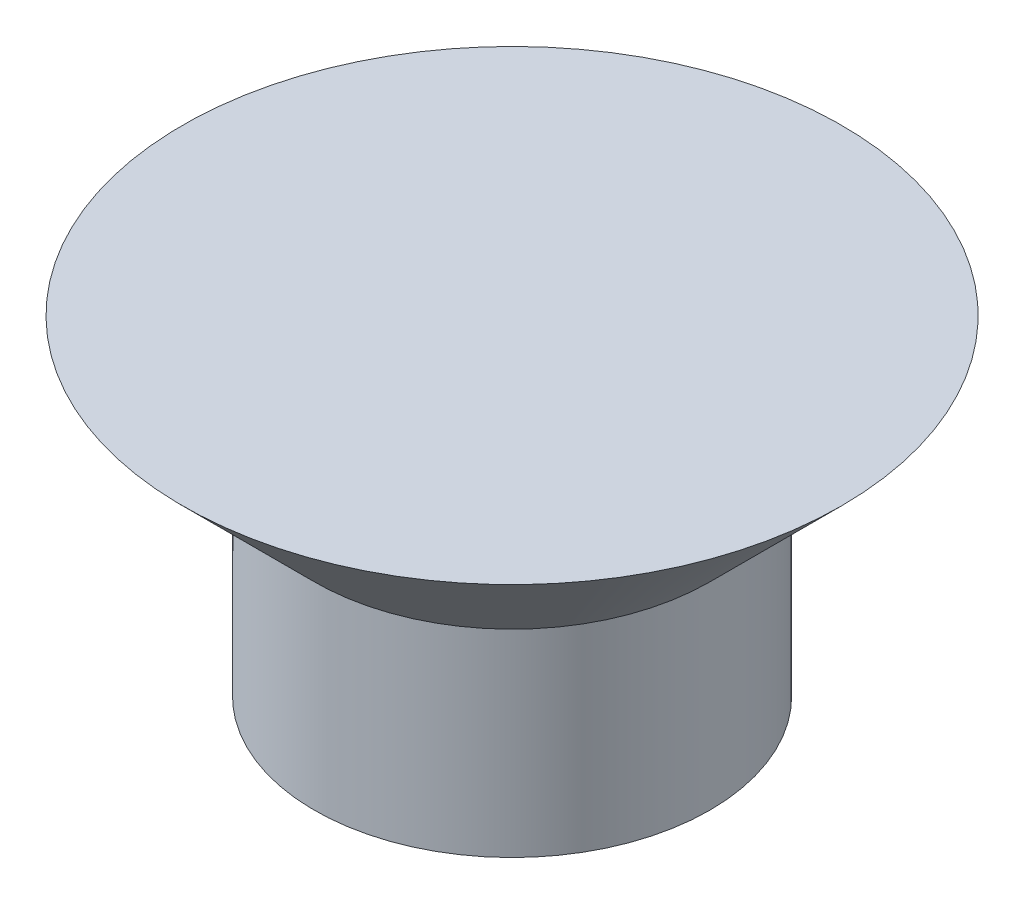
ISO-10303-21;
HEADER;
FILE_DESCRIPTION(('STEP AP214'),'2;1');
FILE_NAME('part.step','',(''),(''),'','','');
FILE_SCHEMA(('AUTOMOTIVE_DESIGN { 1 0 10303 214 1 1 1 1 }'));
ENDSEC;
DATA;
#1=APPLICATION_CONTEXT('core data for automotive mechanical design processes');
#2=APPLICATION_PROTOCOL_DEFINITION('international standard','automotive_design',2000,#1);
#3=PRODUCT_CONTEXT('',#1,'mechanical');
#4=PRODUCT('Part','Part','',(#3));
#5=PRODUCT_RELATED_PRODUCT_CATEGORY('part','',(#4));
#6=PRODUCT_DEFINITION_FORMATION('','',#4);
#7=PRODUCT_DEFINITION_CONTEXT('part definition',#1,'design');
#8=PRODUCT_DEFINITION('design','',#6,#7);
#9=PRODUCT_DEFINITION_SHAPE('','',#8);
#10=(LENGTH_UNIT() NAMED_UNIT(*) SI_UNIT(.MILLI.,.METRE.));
#11=(NAMED_UNIT(*) PLANE_ANGLE_UNIT() SI_UNIT($,.RADIAN.));
#12=(NAMED_UNIT(*) SI_UNIT($,.STERADIAN.) SOLID_ANGLE_UNIT());
#13=UNCERTAINTY_MEASURE_WITH_UNIT(LENGTH_MEASURE(1.E-05),#10,'distance_accuracy_value','');
#14=(GEOMETRIC_REPRESENTATION_CONTEXT(3) GLOBAL_UNCERTAINTY_ASSIGNED_CONTEXT((#13)) GLOBAL_UNIT_ASSIGNED_CONTEXT((#10,
#11,#12)) REPRESENTATION_CONTEXT('',''));
#15=CARTESIAN_POINT('',(0.,0.,0.));
#16=DIRECTION('',(0.,0.,1.));
#17=DIRECTION('',(1.,0.,0.));
#18=AXIS2_PLACEMENT_3D('',#15,#16,#17);
#19=CARTESIAN_POINT('',(1.5,0.,0.));
#20=DIRECTION('',(0.,-1.,0.));
#21=DIRECTION('',(1.,0.,0.));
#22=AXIS2_PLACEMENT_3D('',#19,#20,#21);
#23=PLANE('',#22);
#24=CARTESIAN_POINT('',(0.,0.,0.));
#25=DIRECTION('',(0.,-1.,0.));
#26=DIRECTION('',(1.,0.,0.));
#27=AXIS2_PLACEMENT_3D('',#24,#25,#26);
#28=CIRCLE('',#27,1.5);
#29=CARTESIAN_POINT('',(1.5,0.,0.));
#30=VERTEX_POINT('',#29);
#31=EDGE_CURVE('E48',#30,#30,#28,.T.);
#32=ORIENTED_EDGE('',*,*,#31,.T.);
#33=EDGE_LOOP('',(#32));
#34=FACE_BOUND('',#33,.T.);
#35=ADVANCED_FACE('F38',(#34),#23,.T.);
#36=CARTESIAN_POINT('',(0.,2.5,0.));
#37=DIRECTION('',(0.,1.,0.));
#38=DIRECTION('',(-1.,0.,0.));
#39=AXIS2_PLACEMENT_3D('',#36,#37,#38);
#40=PLANE('',#39);
#41=CARTESIAN_POINT('',(0.,2.5,0.));
#42=DIRECTION('',(0.,-1.,0.));
#43=DIRECTION('',(1.,0.,0.));
#44=AXIS2_PLACEMENT_3D('',#41,#42,#43);
#45=CIRCLE('',#44,2.5);
#46=CARTESIAN_POINT('',(2.5,2.5,0.));
#47=VERTEX_POINT('',#46);
#48=EDGE_CURVE('E11',#47,#47,#45,.T.);
#49=ORIENTED_EDGE('',*,*,#48,.F.);
#50=EDGE_LOOP('',(#49));
#51=FACE_BOUND('',#50,.T.);
#52=ADVANCED_FACE('F63',(#51),#40,.T.);
#53=CARTESIAN_POINT('',(0.,1.5,0.));
#54=DIRECTION('',(0.,1.,0.));
#55=DIRECTION('',(-1.,0.,0.));
#56=AXIS2_PLACEMENT_3D('',#53,#54,#55);
#57=CONICAL_SURFACE('',#56,1.5,0.785398163397448);
#58=ORIENTED_EDGE('',*,*,#48,.T.);
#59=EDGE_LOOP('',(#58));
#60=FACE_BOUND('',#59,.T.);
#61=CARTESIAN_POINT('',(0.,1.5,0.));
#62=DIRECTION('',(0.,-1.,0.));
#63=DIRECTION('',(1.,0.,0.));
#64=AXIS2_PLACEMENT_3D('',#61,#62,#63);
#65=CIRCLE('',#64,1.5);
#66=CARTESIAN_POINT('',(1.5,1.5,0.));
#67=VERTEX_POINT('',#66);
#68=EDGE_CURVE('E44',#67,#67,#65,.T.);
#69=ORIENTED_EDGE('',*,*,#68,.F.);
#70=EDGE_LOOP('',(#69));
#71=FACE_BOUND('',#70,.T.);
#72=ADVANCED_FACE('F58',(#60,#71),#57,.T.);
#73=CARTESIAN_POINT('',(0.,0.,0.));
#74=DIRECTION('',(0.,-1.,0.));
#75=DIRECTION('',(1.,0.,0.));
#76=AXIS2_PLACEMENT_3D('',#73,#74,#75);
#77=CYLINDRICAL_SURFACE('',#76,1.5);
#78=ORIENTED_EDGE('',*,*,#68,.T.);
#79=EDGE_LOOP('',(#78));
#80=FACE_BOUND('',#79,.T.);
#81=ORIENTED_EDGE('',*,*,#31,.F.);
#82=EDGE_LOOP('',(#81));
#83=FACE_BOUND('',#82,.T.);
#84=ADVANCED_FACE('F56',(#80,#83),#77,.T.);
#85=CLOSED_SHELL('',(#35,#52,#72,#84));
#86=MANIFOLD_SOLID_BREP('B2',#85);
#87=ADVANCED_BREP_SHAPE_REPRESENTATION('',(#18,#86),#14);
#88=SHAPE_DEFINITION_REPRESENTATION(#9,#87);
ENDSEC;
END-ISO-10303-21;
